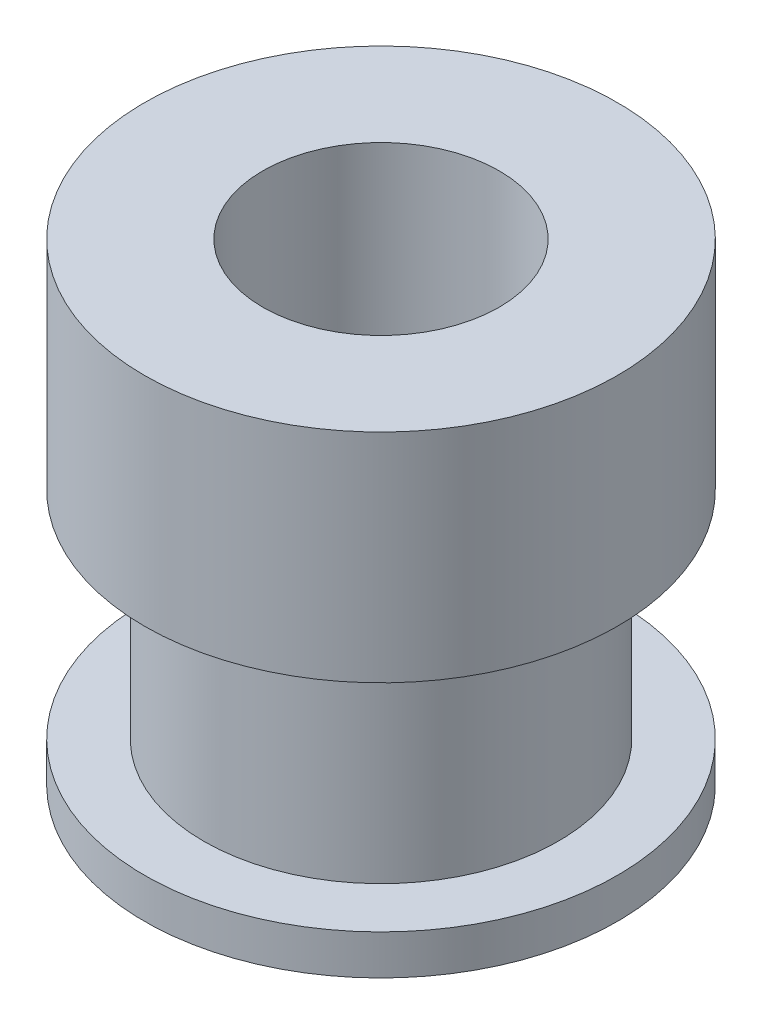
ISO-10303-21;
HEADER;
FILE_DESCRIPTION(('STEP AP214'),'2;1');
FILE_NAME('part.step','',(''),(''),'','','');
FILE_SCHEMA(('AUTOMOTIVE_DESIGN { 1 0 10303 214 1 1 1 1 }'));
ENDSEC;
DATA;
#1=APPLICATION_CONTEXT('core data for automotive mechanical design processes');
#2=APPLICATION_PROTOCOL_DEFINITION('international standard','automotive_design',2000,#1);
#3=PRODUCT_CONTEXT('',#1,'mechanical');
#4=PRODUCT('Part','Part','',(#3));
#5=PRODUCT_RELATED_PRODUCT_CATEGORY('part','',(#4));
#6=PRODUCT_DEFINITION_FORMATION('','',#4);
#7=PRODUCT_DEFINITION_CONTEXT('part definition',#1,'design');
#8=PRODUCT_DEFINITION('design','',#6,#7);
#9=PRODUCT_DEFINITION_SHAPE('','',#8);
#10=(LENGTH_UNIT() NAMED_UNIT(*) SI_UNIT(.MILLI.,.METRE.));
#11=(NAMED_UNIT(*) PLANE_ANGLE_UNIT() SI_UNIT($,.RADIAN.));
#12=(NAMED_UNIT(*) SI_UNIT($,.STERADIAN.) SOLID_ANGLE_UNIT());
#13=UNCERTAINTY_MEASURE_WITH_UNIT(LENGTH_MEASURE(1.E-05),#10,'distance_accuracy_value','');
#14=(GEOMETRIC_REPRESENTATION_CONTEXT(3) GLOBAL_UNCERTAINTY_ASSIGNED_CONTEXT((#13)) GLOBAL_UNIT_ASSIGNED_CONTEXT((#10,
#11,#12)) REPRESENTATION_CONTEXT('',''));
#15=CARTESIAN_POINT('',(0.,0.,0.));
#16=DIRECTION('',(0.,0.,1.));
#17=DIRECTION('',(1.,0.,0.));
#18=AXIS2_PLACEMENT_3D('',#15,#16,#17);
#19=CARTESIAN_POINT('',(0.,1.35,0.));
#20=DIRECTION('',(0.,-1.,0.));
#21=DIRECTION('',(0.,0.,-1.));
#22=AXIS2_PLACEMENT_3D('',#19,#20,#21);
#23=CYLINDRICAL_SURFACE('',#22,8.);
#24=CARTESIAN_POINT('',(0.,1.35,0.));
#25=DIRECTION('',(0.,1.,0.));
#26=DIRECTION('',(0.,0.,1.));
#27=AXIS2_PLACEMENT_3D('',#24,#25,#26);
#28=CIRCLE('',#27,8.);
#29=CARTESIAN_POINT('',(0.,1.35,-8.));
#30=VERTEX_POINT('',#29);
#31=EDGE_CURVE('E43',#30,#30,#28,.T.);
#32=CARTESIAN_POINT('',(0.,0.,0.));
#33=DIRECTION('',(0.,1.,0.));
#34=DIRECTION('',(0.,0.,1.));
#35=AXIS2_PLACEMENT_3D('',#32,#33,#34);
#36=CIRCLE('',#35,8.);
#37=CARTESIAN_POINT('',(0.,0.,-8.));
#38=VERTEX_POINT('',#37);
#39=EDGE_CURVE('E39',#38,#38,#36,.T.);
#40=CARTESIAN_POINT('',(0.,1.35,-8.));
#41=CARTESIAN_POINT('',(0.,1.3359375,-8.));
#42=CARTESIAN_POINT('',(0.,1.321875,-8.));
#43=CARTESIAN_POINT('',(0.,1.29375,-8.));
#44=CARTESIAN_POINT('',(0.,1.2796875,-8.));
#45=CARTESIAN_POINT('',(0.,1.2515625,-8.));
#46=CARTESIAN_POINT('',(0.,1.2375,-8.));
#47=CARTESIAN_POINT('',(0.,1.209375,-8.));
#48=CARTESIAN_POINT('',(0.,1.1953125,-8.));
#49=CARTESIAN_POINT('',(0.,1.1671875,-8.));
#50=CARTESIAN_POINT('',(0.,1.153125,-8.));
#51=CARTESIAN_POINT('',(0.,1.125,-8.));
#52=CARTESIAN_POINT('',(0.,1.1109375,-8.));
#53=CARTESIAN_POINT('',(0.,1.0828125,-8.));
#54=CARTESIAN_POINT('',(0.,1.06875,-8.));
#55=CARTESIAN_POINT('',(0.,1.040625,-8.));
#56=CARTESIAN_POINT('',(0.,1.0265625,-8.));
#57=CARTESIAN_POINT('',(0.,0.9984375,-8.));
#58=CARTESIAN_POINT('',(0.,0.984375,-8.));
#59=CARTESIAN_POINT('',(0.,0.95625,-8.));
#60=CARTESIAN_POINT('',(0.,0.9421875,-8.));
#61=CARTESIAN_POINT('',(0.,0.9140625,-8.));
#62=CARTESIAN_POINT('',(0.,0.9,-8.));
#63=CARTESIAN_POINT('',(0.,0.871875,-8.));
#64=CARTESIAN_POINT('',(0.,0.8578125,-8.));
#65=CARTESIAN_POINT('',(0.,0.8296875,-8.));
#66=CARTESIAN_POINT('',(0.,0.815625,-8.));
#67=CARTESIAN_POINT('',(0.,0.7875,-8.));
#68=CARTESIAN_POINT('',(0.,0.7734375,-8.));
#69=CARTESIAN_POINT('',(0.,0.7453125,-8.));
#70=CARTESIAN_POINT('',(0.,0.73125,-8.));
#71=CARTESIAN_POINT('',(0.,0.703125,-8.));
#72=CARTESIAN_POINT('',(0.,0.6890625,-8.));
#73=CARTESIAN_POINT('',(0.,0.6609375,-8.));
#74=CARTESIAN_POINT('',(0.,0.646875,-8.));
#75=CARTESIAN_POINT('',(0.,0.61875,-8.));
#76=CARTESIAN_POINT('',(0.,0.6046875,-8.));
#77=CARTESIAN_POINT('',(0.,0.5765625,-8.));
#78=CARTESIAN_POINT('',(0.,0.5625,-8.));
#79=CARTESIAN_POINT('',(0.,0.534375,-8.));
#80=CARTESIAN_POINT('',(0.,0.5203125,-8.));
#81=CARTESIAN_POINT('',(0.,0.4921875,-8.));
#82=CARTESIAN_POINT('',(0.,0.478125,-8.));
#83=CARTESIAN_POINT('',(0.,0.45,-8.));
#84=CARTESIAN_POINT('',(0.,0.4359375,-8.));
#85=CARTESIAN_POINT('',(0.,0.4078125,-8.));
#86=CARTESIAN_POINT('',(0.,0.39375,-8.));
#87=CARTESIAN_POINT('',(0.,0.365625,-8.));
#88=CARTESIAN_POINT('',(0.,0.3515625,-8.));
#89=CARTESIAN_POINT('',(0.,0.3234375,-8.));
#90=CARTESIAN_POINT('',(0.,0.309375,-8.));
#91=CARTESIAN_POINT('',(0.,0.28125,-8.));
#92=CARTESIAN_POINT('',(0.,0.2671875,-8.));
#93=CARTESIAN_POINT('',(0.,0.2390625,-8.));
#94=CARTESIAN_POINT('',(0.,0.225,-8.));
#95=CARTESIAN_POINT('',(0.,0.196875,-8.));
#96=CARTESIAN_POINT('',(0.,0.1828125,-8.));
#97=CARTESIAN_POINT('',(0.,0.1546875,-8.));
#98=CARTESIAN_POINT('',(0.,0.140625,-8.));
#99=CARTESIAN_POINT('',(0.,0.1125,-8.));
#100=CARTESIAN_POINT('',(0.,0.0984374999999998,-8.));
#101=CARTESIAN_POINT('',(0.,0.0703124999999998,-8.));
#102=CARTESIAN_POINT('',(0.,0.0562499999999997,-8.));
#103=CARTESIAN_POINT('',(0.,0.0281249999999997,-8.));
#104=CARTESIAN_POINT('',(0.,0.0140624999999997,-8.));
#105=CARTESIAN_POINT('',(0.,0.,-8.));
#106=B_SPLINE_CURVE_WITH_KNOTS('',3,(#40,#41,#42,#43,#44,#45,#46,#47,#48,#49,#50,#51,#52,#53,
#54,#55,#56,#57,#58,#59,#60,#61,#62,#63,#64,#65,#66,#67,#68,#69,#70,#71,#72,#73,#74,#75,#76,#77,
#78,#79,#80,#81,#82,#83,#84,#85,#86,#87,#88,#89,#90,#91,#92,#93,#94,#95,#96,#97,#98,#99,#100,
#101,#102,#103,#104,#105),.UNSPECIFIED.,.F.,.F.,(4,2,2,2,2,2,2,2,2,2,2,2,2,2,2,2,2,2,2,2,2,2,2,
2,2,2,2,2,2,2,2,2,4),(0.,0.0421874999999999,0.0843749999999998,0.1265625,0.16875,0.2109375,
0.253125,0.2953125,0.3375,0.3796875,0.421875,0.4640625,0.50625,0.5484375,0.590625,0.6328125,
0.675,0.7171875,0.759375,0.8015625,0.84375,0.8859375,0.928125,0.9703125,1.0125,1.0546875,
1.096875,1.1390625,1.18125,1.2234375,1.265625,1.3078125,1.35),.UNSPECIFIED.);
#107=EDGE_CURVE('BSEAM36',#30,#38,#106,.T.);
#108=ORIENTED_EDGE('',*,*,#31,.F.);
#109=ORIENTED_EDGE('',*,*,#39,.T.);
#110=ORIENTED_EDGE('',*,*,#107,.T.);
#111=ORIENTED_EDGE('',*,*,#107,.F.);
#112=EDGE_LOOP('',(#108,#110,#109,#111));
#113=FACE_BOUND('',#112,.T.);
#114=ADVANCED_FACE('F36',(#113),#23,.T.);
#115=CARTESIAN_POINT('',(0.,1.35,0.));
#116=DIRECTION('',(0.,1.,0.));
#117=DIRECTION('',(0.,0.,1.));
#118=AXIS2_PLACEMENT_3D('',#115,#116,#117);
#119=PLANE('',#118);
#120=CARTESIAN_POINT('',(0.,1.35,0.));
#121=DIRECTION('',(0.,1.,0.));
#122=DIRECTION('',(0.,0.,1.));
#123=AXIS2_PLACEMENT_3D('',#120,#121,#122);
#124=CIRCLE('',#123,6.);
#125=CARTESIAN_POINT('',(0.,1.35,6.));
#126=VERTEX_POINT('',#125);
#127=EDGE_CURVE('E10',#126,#126,#124,.T.);
#128=ORIENTED_EDGE('',*,*,#127,.F.);
#129=EDGE_LOOP('',(#128));
#130=FACE_BOUND('',#129,.T.);
#131=ORIENTED_EDGE('',*,*,#31,.T.);
#132=EDGE_LOOP('',(#131));
#133=FACE_BOUND('',#132,.T.);
#134=ADVANCED_FACE('F79',(#130,#133),#119,.T.);
#135=CARTESIAN_POINT('',(0.,0.,0.));
#136=DIRECTION('',(0.,1.,0.));
#137=DIRECTION('',(0.,0.,1.));
#138=AXIS2_PLACEMENT_3D('',#135,#136,#137);
#139=PLANE('',#138);
#140=CARTESIAN_POINT('',(0.,0.,0.));
#141=DIRECTION('',(0.,-1.,0.));
#142=DIRECTION('',(0.,0.,-1.));
#143=AXIS2_PLACEMENT_3D('',#140,#141,#142);
#144=CIRCLE('',#143,4.);
#145=CARTESIAN_POINT('',(0.,0.,-4.));
#146=VERTEX_POINT('',#145);
#147=EDGE_CURVE('E59',#146,#146,#144,.T.);
#148=ORIENTED_EDGE('',*,*,#147,.F.);
#149=EDGE_LOOP('',(#148));
#150=FACE_BOUND('',#149,.T.);
#151=ORIENTED_EDGE('',*,*,#39,.F.);
#152=EDGE_LOOP('',(#151));
#153=FACE_BOUND('',#152,.T.);
#154=ADVANCED_FACE('F75',(#150,#153),#139,.F.);
#155=CARTESIAN_POINT('',(0.,8.65,0.));
#156=DIRECTION('',(0.,-1.,0.));
#157=DIRECTION('',(0.,0.,-1.));
#158=AXIS2_PLACEMENT_3D('',#155,#156,#157);
#159=CYLINDRICAL_SURFACE('',#158,6.);
#160=CARTESIAN_POINT('',(0.,8.65,0.));
#161=DIRECTION('',(0.,1.,0.));
#162=DIRECTION('',(0.,0.,1.));
#163=AXIS2_PLACEMENT_3D('',#160,#161,#162);
#164=CIRCLE('',#163,6.);
#165=CARTESIAN_POINT('',(0.,8.65,6.));
#166=VERTEX_POINT('',#165);
#167=EDGE_CURVE('E49',#166,#166,#164,.T.);
#168=ORIENTED_EDGE('',*,*,#167,.F.);
#169=EDGE_LOOP('',(#168));
#170=FACE_BOUND('',#169,.T.);
#171=ORIENTED_EDGE('',*,*,#127,.T.);
#172=EDGE_LOOP('',(#171));
#173=FACE_BOUND('',#172,.T.);
#174=ADVANCED_FACE('F78',(#170,#173),#159,.T.);
#175=CARTESIAN_POINT('',(0.,16.,0.));
#176=DIRECTION('',(0.,-1.,0.));
#177=DIRECTION('',(0.,0.,-1.));
#178=AXIS2_PLACEMENT_3D('',#175,#176,#177);
#179=CYLINDRICAL_SURFACE('',#178,8.);
#180=CARTESIAN_POINT('',(0.,16.,0.));
#181=DIRECTION('',(0.,1.,0.));
#182=DIRECTION('',(0.,0.,1.));
#183=AXIS2_PLACEMENT_3D('',#180,#181,#182);
#184=CIRCLE('',#183,8.);
#185=CARTESIAN_POINT('',(0.,16.,8.));
#186=VERTEX_POINT('',#185);
#187=EDGE_CURVE('E52',#186,#186,#184,.T.);
#188=ORIENTED_EDGE('',*,*,#187,.F.);
#189=EDGE_LOOP('',(#188));
#190=FACE_BOUND('',#189,.T.);
#191=CARTESIAN_POINT('',(0.,8.65,0.));
#192=DIRECTION('',(0.,1.,0.));
#193=DIRECTION('',(0.,0.,1.));
#194=AXIS2_PLACEMENT_3D('',#191,#192,#193);
#195=CIRCLE('',#194,8.);
#196=CARTESIAN_POINT('',(0.,8.65,8.));
#197=VERTEX_POINT('',#196);
#198=EDGE_CURVE('E53',#197,#197,#195,.T.);
#199=ORIENTED_EDGE('',*,*,#198,.T.);
#200=EDGE_LOOP('',(#199));
#201=FACE_BOUND('',#200,.T.);
#202=ADVANCED_FACE('F97',(#190,#201),#179,.T.);
#203=CARTESIAN_POINT('',(0.,16.,0.));
#204=DIRECTION('',(0.,1.,0.));
#205=DIRECTION('',(0.,0.,1.));
#206=AXIS2_PLACEMENT_3D('',#203,#204,#205);
#207=PLANE('',#206);
#208=CARTESIAN_POINT('',(0.,16.,0.));
#209=DIRECTION('',(0.,-1.,0.));
#210=DIRECTION('',(0.,0.,-1.));
#211=AXIS2_PLACEMENT_3D('',#208,#209,#210);
#212=CIRCLE('',#211,4.);
#213=CARTESIAN_POINT('',(0.,16.,-4.));
#214=VERTEX_POINT('',#213);
#215=EDGE_CURVE('E56',#214,#214,#212,.T.);
#216=ORIENTED_EDGE('',*,*,#215,.T.);
#217=EDGE_LOOP('',(#216));
#218=FACE_BOUND('',#217,.T.);
#219=ORIENTED_EDGE('',*,*,#187,.T.);
#220=EDGE_LOOP('',(#219));
#221=FACE_BOUND('',#220,.T.);
#222=ADVANCED_FACE('F65',(#218,#221),#207,.T.);
#223=CARTESIAN_POINT('',(0.,8.65,0.));
#224=DIRECTION('',(0.,1.,0.));
#225=DIRECTION('',(0.,0.,1.));
#226=AXIS2_PLACEMENT_3D('',#223,#224,#225);
#227=PLANE('',#226);
#228=ORIENTED_EDGE('',*,*,#167,.T.);
#229=EDGE_LOOP('',(#228));
#230=FACE_BOUND('',#229,.T.);
#231=ORIENTED_EDGE('',*,*,#198,.F.);
#232=EDGE_LOOP('',(#231));
#233=FACE_BOUND('',#232,.T.);
#234=ADVANCED_FACE('F71',(#230,#233),#227,.F.);
#235=CARTESIAN_POINT('',(0.,16.,0.));
#236=DIRECTION('',(0.,-1.,0.));
#237=DIRECTION('',(0.,0.,-1.));
#238=AXIS2_PLACEMENT_3D('',#235,#236,#237);
#239=CYLINDRICAL_SURFACE('',#238,4.);
#240=ORIENTED_EDGE('',*,*,#215,.F.);
#241=EDGE_LOOP('',(#240));
#242=FACE_BOUND('',#241,.T.);
#243=ORIENTED_EDGE('',*,*,#147,.T.);
#244=EDGE_LOOP('',(#243));
#245=FACE_BOUND('',#244,.T.);
#246=ADVANCED_FACE('F68',(#242,#245),#239,.F.);
#247=CLOSED_SHELL('',(#114,#134,#154,#174,#202,#222,#234,#246));
#248=MANIFOLD_SOLID_BREP('B2',#247);
#249=ADVANCED_BREP_SHAPE_REPRESENTATION('',(#18,#248),#14);
#250=SHAPE_DEFINITION_REPRESENTATION(#9,#249);
ENDSEC;
END-ISO-10303-21;
